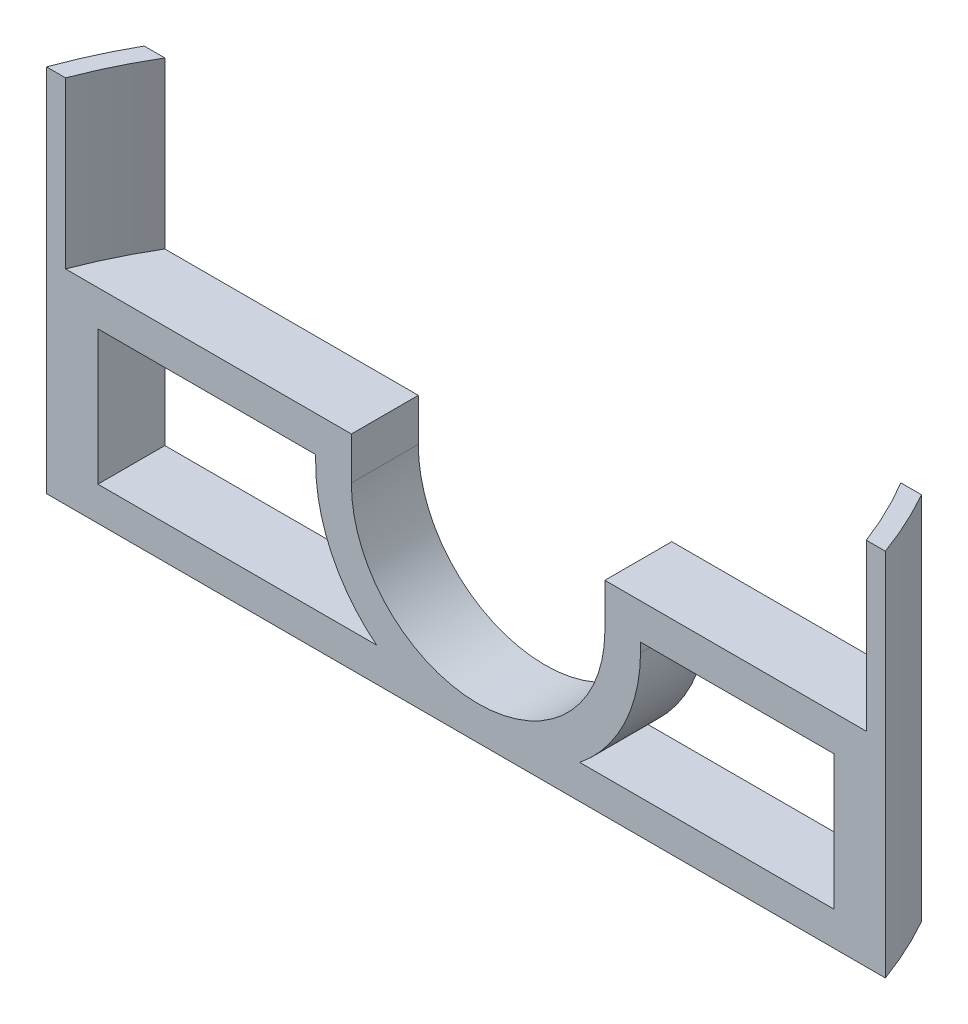
ISO-10303-21;
HEADER;
FILE_DESCRIPTION(('STEP AP214'),'2;1');
FILE_NAME('part.step','',(''),(''),'','','');
FILE_SCHEMA(('AUTOMOTIVE_DESIGN { 1 0 10303 214 1 1 1 1 }'));
ENDSEC;
DATA;
#1=APPLICATION_CONTEXT('core data for automotive mechanical design processes');
#2=APPLICATION_PROTOCOL_DEFINITION('international standard','automotive_design',2000,#1);
#3=PRODUCT_CONTEXT('',#1,'mechanical');
#4=PRODUCT('Part','Part','',(#3));
#5=PRODUCT_RELATED_PRODUCT_CATEGORY('part','',(#4));
#6=PRODUCT_DEFINITION_FORMATION('','',#4);
#7=PRODUCT_DEFINITION_CONTEXT('part definition',#1,'design');
#8=PRODUCT_DEFINITION('design','',#6,#7);
#9=PRODUCT_DEFINITION_SHAPE('','',#8);
#10=(LENGTH_UNIT() NAMED_UNIT(*) SI_UNIT(.MILLI.,.METRE.));
#11=(NAMED_UNIT(*) PLANE_ANGLE_UNIT() SI_UNIT($,.RADIAN.));
#12=(NAMED_UNIT(*) SI_UNIT($,.STERADIAN.) SOLID_ANGLE_UNIT());
#13=UNCERTAINTY_MEASURE_WITH_UNIT(LENGTH_MEASURE(1.E-05),#10,'distance_accuracy_value','');
#14=(GEOMETRIC_REPRESENTATION_CONTEXT(3) GLOBAL_UNCERTAINTY_ASSIGNED_CONTEXT((#13)) GLOBAL_UNIT_ASSIGNED_CONTEXT((#10,
#11,#12)) REPRESENTATION_CONTEXT('',''));
#15=CARTESIAN_POINT('',(0.,0.,0.));
#16=DIRECTION('',(0.,0.,1.));
#17=DIRECTION('',(1.,0.,0.));
#18=AXIS2_PLACEMENT_3D('',#15,#16,#17);
#19=CARTESIAN_POINT('',(61.4495521008681,24.1826103592965,7.5));
#20=DIRECTION('',(0.,0.,1.));
#21=DIRECTION('',(1.,0.,0.));
#22=AXIS2_PLACEMENT_3D('',#19,#20,#21);
#23=PLANE('',#22);
#24=DIRECTION('',(1.,0.,0.));
#25=VECTOR('',#24,1.);
#26=CARTESIAN_POINT('',(18.8436483280103,9.98314343639811,7.5));
#27=LINE('',#26,#25);
#28=CARTESIAN_POINT('',(18.8436483280103,9.98314343639811,7.5));
#29=VERTEX_POINT('',#28);
#30=CARTESIAN_POINT('',(50.0648392881245,9.98314343620562,7.5));
#31=VERTEX_POINT('',#30);
#32=EDGE_CURVE('E64',#29,#31,#27,.T.);
#33=ORIENTED_EDGE('',*,*,#32,.F.);
#34=DIRECTION('',(0.,-1.,0.));
#35=VECTOR('',#34,1.);
#36=CARTESIAN_POINT('',(18.8436483280103,25.0604388623193,7.5));
#37=LINE('',#36,#35);
#38=CARTESIAN_POINT('',(18.8436483280103,25.0604388623193,7.5));
#39=VERTEX_POINT('',#38);
#40=EDGE_CURVE('E247',#39,#29,#37,.T.);
#41=ORIENTED_EDGE('',*,*,#40,.F.);
#42=DIRECTION('',(-1.,0.,0.));
#43=VECTOR('',#42,1.);
#44=CARTESIAN_POINT('',(43.2500851779697,25.0604388623193,7.5));
#45=LINE('',#44,#43);
#46=CARTESIAN_POINT('',(43.2500851779697,25.0604388623193,7.5));
#47=VERTEX_POINT('',#46);
#48=EDGE_CURVE('E244',#47,#39,#45,.T.);
#49=ORIENTED_EDGE('',*,*,#48,.F.);
#50=DIRECTION('',(0.,1.,0.));
#51=VECTOR('',#50,1.);
#52=CARTESIAN_POINT('',(43.2500851779697,24.3056514317656,7.5));
#53=LINE('',#52,#51);
#54=CARTESIAN_POINT('',(43.2500851779697,24.3056514317656,7.5));
#55=VERTEX_POINT('',#54);
#56=EDGE_CURVE('E248',#55,#47,#53,.T.);
#57=ORIENTED_EDGE('',*,*,#56,.F.);
#58=CARTESIAN_POINT('',(61.4496106788494,24.1826099074887,7.5));
#59=DIRECTION('',(0.,0.,-1.));
#60=DIRECTION('',(-0.625538903013742,-0.780192976651524,0.));
#61=AXIS2_PLACEMENT_3D('',#58,#59,#60);
#62=CIRCLE('',#61,18.1999414199102);
#63=EDGE_CURVE('E362',#31,#55,#62,.T.);
#64=ORIENTED_EDGE('',*,*,#63,.F.);
#65=EDGE_LOOP('',(#33,#41,#49,#57,#64));
#66=FACE_BOUND('',#65,.T.);
#67=DIRECTION('',(1.,0.,0.));
#68=VECTOR('',#67,1.);
#69=CARTESIAN_POINT('',(108.081997981979,6.18261035929651,7.5));
#70=LINE('',#69,#68);
#71=CARTESIAN_POINT('',(13.0839761771822,6.1826103592965,7.5));
#72=VERTEX_POINT('',#71);
#73=CARTESIAN_POINT('',(107.080019786776,6.18261035929651,7.50000000000001));
#74=VERTEX_POINT('',#73);
#75=EDGE_CURVE('E329',#72,#74,#70,.T.);
#76=ORIENTED_EDGE('',*,*,#75,.T.);
#77=DIRECTION('',(0.,1.,0.));
#78=VECTOR('',#77,1.);
#79=CARTESIAN_POINT('',(107.080019786776,-3.27380668338016,7.50000000000001));
#80=LINE('',#79,#78);
#81=CARTESIAN_POINT('',(107.080019786776,47.6004388623193,7.50000000000001));
#82=VERTEX_POINT('',#81);
#83=EDGE_CURVE('E309',#74,#82,#80,.T.);
#84=ORIENTED_EDGE('',*,*,#83,.T.);
#85=DIRECTION('',(1.,0.,0.));
#86=VECTOR('',#85,1.);
#87=CARTESIAN_POINT('',(104.946394261926,47.6004388623193,7.50000000000001));
#88=LINE('',#87,#86);
#89=CARTESIAN_POINT('',(104.946394261926,47.6004388623193,7.50000000000003));
#90=VERTEX_POINT('',#89);
#91=EDGE_CURVE('E297',#90,#82,#88,.T.);
#92=ORIENTED_EDGE('',*,*,#91,.F.);
#93=DIRECTION('',(0.,1.,0.));
#94=VECTOR('',#93,1.);
#95=CARTESIAN_POINT('',(104.946394261926,-3.27380668338016,7.50000000000003));
#96=LINE('',#95,#94);
#97=CARTESIAN_POINT('',(104.946394261926,29.0604388623193,7.50000000000003));
#98=VERTEX_POINT('',#97);
#99=EDGE_CURVE('E310',#98,#90,#96,.T.);
#100=ORIENTED_EDGE('',*,*,#99,.F.);
#101=DIRECTION('',(-1.,0.,0.));
#102=VECTOR('',#101,1.);
#103=CARTESIAN_POINT('',(75.6490190237665,29.0604388623193,7.5));
#104=LINE('',#103,#102);
#105=CARTESIAN_POINT('',(75.6490190237665,29.0604388623193,7.5));
#106=VERTEX_POINT('',#105);
#107=EDGE_CURVE('E332',#98,#106,#104,.T.);
#108=ORIENTED_EDGE('',*,*,#107,.T.);
#109=DIRECTION('',(0.,-1.,0.));
#110=VECTOR('',#109,1.);
#111=CARTESIAN_POINT('',(75.6490190237665,24.0595692868282,7.5));
#112=LINE('',#111,#110);
#113=CARTESIAN_POINT('',(75.6490190237665,24.0595692868282,7.5));
#114=VERTEX_POINT('',#113);
#115=EDGE_CURVE('E334',#106,#114,#112,.T.);
#116=ORIENTED_EDGE('',*,*,#115,.T.);
#117=CARTESIAN_POINT('',(61.4495521008681,24.1826103592965,7.5));
#118=DIRECTION('',(0.,0.,-1.));
#119=DIRECTION('',(1.,0.,0.));
#120=AXIS2_PLACEMENT_3D('',#117,#118,#119);
#121=CIRCLE('',#120,14.2);
#122=CARTESIAN_POINT('',(47.2500851779697,24.3056514317656,7.5));
#123=VERTEX_POINT('',#122);
#124=EDGE_CURVE('E320',#114,#123,#121,.T.);
#125=ORIENTED_EDGE('',*,*,#124,.T.);
#126=DIRECTION('',(0.,1.,0.));
#127=VECTOR('',#126,1.);
#128=CARTESIAN_POINT('',(47.2500851779697,24.3056514317656,7.5));
#129=LINE('',#128,#127);
#130=CARTESIAN_POINT('',(47.2500851779697,29.0604388623193,7.5));
#131=VERTEX_POINT('',#130);
#132=EDGE_CURVE('E323',#123,#131,#129,.T.);
#133=ORIENTED_EDGE('',*,*,#132,.T.);
#134=DIRECTION('',(-1.,0.,0.));
#135=VECTOR('',#134,1.);
#136=CARTESIAN_POINT('',(12.081997981979,29.0604388623193,7.5));
#137=LINE('',#136,#135);
#138=CARTESIAN_POINT('',(15.2176017020316,29.0604388623193,7.49999999999999));
#139=VERTEX_POINT('',#138);
#140=EDGE_CURVE('E326',#131,#139,#137,.T.);
#141=ORIENTED_EDGE('',*,*,#140,.T.);
#142=DIRECTION('',(0.,1.,0.));
#143=VECTOR('',#142,1.);
#144=CARTESIAN_POINT('',(15.2176017020316,-3.27380668338017,7.49999999999999));
#145=LINE('',#144,#143);
#146=CARTESIAN_POINT('',(15.2176017020316,47.6004388623193,7.49999999999999));
#147=VERTEX_POINT('',#146);
#148=EDGE_CURVE('E281',#139,#147,#145,.T.);
#149=ORIENTED_EDGE('',*,*,#148,.T.);
#150=DIRECTION('',(-1.,0.,0.));
#151=VECTOR('',#150,1.);
#152=CARTESIAN_POINT('',(15.2176017020316,47.6004388623193,7.5));
#153=LINE('',#152,#151);
#154=CARTESIAN_POINT('',(13.0839761771822,47.6004388623193,7.5));
#155=VERTEX_POINT('',#154);
#156=EDGE_CURVE('E286',#147,#155,#153,.T.);
#157=ORIENTED_EDGE('',*,*,#156,.T.);
#158=DIRECTION('',(0.,1.,0.));
#159=VECTOR('',#158,1.);
#160=CARTESIAN_POINT('',(13.0839761771822,-3.27380668338017,7.5));
#161=LINE('',#160,#159);
#162=EDGE_CURVE('E279',#72,#155,#161,.T.);
#163=ORIENTED_EDGE('',*,*,#162,.F.);
#164=EDGE_LOOP('',(#76,#84,#92,#100,#108,#116,#125,#133,#141,#149,#157,#163));
#165=FACE_BOUND('',#164,.T.);
#166=DIRECTION('',(1.,0.,0.));
#167=VECTOR('',#166,1.);
#168=CARTESIAN_POINT('',(72.8343820702114,9.98314343639811,7.5));
#169=LINE('',#168,#167);
#170=CARTESIAN_POINT('',(72.8343820701038,9.98314343631216,7.5));
#171=VERTEX_POINT('',#170);
#172=CARTESIAN_POINT('',(101.320347635948,9.98314343639811,7.5));
#173=VERTEX_POINT('',#172);
#174=EDGE_CURVE('E56',#171,#173,#169,.T.);
#175=ORIENTED_EDGE('',*,*,#174,.F.);
#176=CARTESIAN_POINT('',(61.4496106788494,24.1826099074887,7.5));
#177=DIRECTION('',(0.,0.,-1.));
#178=DIRECTION('',(0.999962459332486,-0.00866486732303254,0.));
#179=AXIS2_PLACEMENT_3D('',#176,#177,#178);
#180=CIRCLE('',#179,18.1999414199102);
#181=CARTESIAN_POINT('',(79.6488688612027,24.0249098297948,7.5));
#182=VERTEX_POINT('',#181);
#183=EDGE_CURVE('E215',#182,#171,#180,.T.);
#184=ORIENTED_EDGE('',*,*,#183,.F.);
#185=DIRECTION('',(-0.000145010480182229,-0.99999998948598,0.));
#186=VECTOR('',#185,1.);
#187=CARTESIAN_POINT('',(79.6490190237665,25.0604388623193,7.5));
#188=LINE('',#187,#186);
#189=CARTESIAN_POINT('',(79.6490190237665,25.0604388623193,7.5));
#190=VERTEX_POINT('',#189);
#191=EDGE_CURVE('E213',#190,#182,#188,.T.);
#192=ORIENTED_EDGE('',*,*,#191,.F.);
#193=DIRECTION('',(-1.,0.,0.));
#194=VECTOR('',#193,1.);
#195=CARTESIAN_POINT('',(101.320347635948,25.0604388623193,7.5));
#196=LINE('',#195,#194);
#197=CARTESIAN_POINT('',(101.320347635948,25.0604388623193,7.5));
#198=VERTEX_POINT('',#197);
#199=EDGE_CURVE('E197',#198,#190,#196,.T.);
#200=ORIENTED_EDGE('',*,*,#199,.F.);
#201=DIRECTION('',(0.,1.,0.));
#202=VECTOR('',#201,1.);
#203=CARTESIAN_POINT('',(101.320347635948,9.98314343639811,7.5));
#204=LINE('',#203,#202);
#205=EDGE_CURVE('E207',#173,#198,#204,.T.);
#206=ORIENTED_EDGE('',*,*,#205,.F.);
#207=EDGE_LOOP('',(#175,#184,#192,#200,#206));
#208=FACE_BOUND('',#207,.T.);
#209=ADVANCED_FACE('F37',(#66,#165,#208),#23,.T.);
#210=CARTESIAN_POINT('',(61.4495521008681,24.1826103592965,0.));
#211=DIRECTION('',(0.,0.,1.));
#212=DIRECTION('',(1.,0.,0.));
#213=AXIS2_PLACEMENT_3D('',#210,#211,#212);
#214=PLANE('',#213);
#215=DIRECTION('',(0.,1.,0.));
#216=VECTOR('',#215,1.);
#217=CARTESIAN_POINT('',(103.631986296363,-3.27380668338016,0.));
#218=LINE('',#217,#216);
#219=CARTESIAN_POINT('',(103.631986296363,6.18261035929651,0.));
#220=VERTEX_POINT('',#219);
#221=CARTESIAN_POINT('',(103.631986296363,47.6004388623193,0.));
#222=VERTEX_POINT('',#221);
#223=EDGE_CURVE('E315',#220,#222,#218,.T.);
#224=ORIENTED_EDGE('',*,*,#223,.F.);
#225=DIRECTION('',(1.,0.,0.));
#226=VECTOR('',#225,1.);
#227=CARTESIAN_POINT('',(108.081997981979,6.18261035929651,0.));
#228=LINE('',#227,#226);
#229=CARTESIAN_POINT('',(16.532009667595,6.1826103592965,0.));
#230=VERTEX_POINT('',#229);
#231=EDGE_CURVE('E344',#230,#220,#228,.T.);
#232=ORIENTED_EDGE('',*,*,#231,.F.);
#233=DIRECTION('',(0.,1.,0.));
#234=VECTOR('',#233,1.);
#235=CARTESIAN_POINT('',(16.5320096675951,-3.27380668338017,0.));
#236=LINE('',#235,#234);
#237=CARTESIAN_POINT('',(16.532009667595,47.6004388623193,0.));
#238=VERTEX_POINT('',#237);
#239=EDGE_CURVE('E276',#230,#238,#236,.T.);
#240=ORIENTED_EDGE('',*,*,#239,.T.);
#241=DIRECTION('',(-1.,0.,0.));
#242=VECTOR('',#241,1.);
#243=CARTESIAN_POINT('',(18.8436483280103,47.6004388623193,0.));
#244=LINE('',#243,#242);
#245=CARTESIAN_POINT('',(18.8436483280103,47.6004388623193,0.));
#246=VERTEX_POINT('',#245);
#247=EDGE_CURVE('E292',#246,#238,#244,.T.);
#248=ORIENTED_EDGE('',*,*,#247,.F.);
#249=DIRECTION('',(0.,1.,0.));
#250=VECTOR('',#249,1.);
#251=CARTESIAN_POINT('',(18.8436483280103,-3.27380668338017,0.));
#252=LINE('',#251,#250);
#253=CARTESIAN_POINT('',(18.8436483280103,29.0604388623193,0.));
#254=VERTEX_POINT('',#253);
#255=EDGE_CURVE('E272',#254,#246,#252,.T.);
#256=ORIENTED_EDGE('',*,*,#255,.F.);
#257=DIRECTION('',(-1.,0.,0.));
#258=VECTOR('',#257,1.);
#259=CARTESIAN_POINT('',(12.081997981979,29.0604388623193,0.));
#260=LINE('',#259,#258);
#261=CARTESIAN_POINT('',(47.2500851779697,29.0604388623193,0.));
#262=VERTEX_POINT('',#261);
#263=EDGE_CURVE('E341',#262,#254,#260,.T.);
#264=ORIENTED_EDGE('',*,*,#263,.F.);
#265=DIRECTION('',(0.,1.,0.));
#266=VECTOR('',#265,1.);
#267=CARTESIAN_POINT('',(47.2500851779697,24.3056514317656,0.));
#268=LINE('',#267,#266);
#269=CARTESIAN_POINT('',(47.2500851779697,24.3056514317656,0.));
#270=VERTEX_POINT('',#269);
#271=EDGE_CURVE('E339',#270,#262,#268,.T.);
#272=ORIENTED_EDGE('',*,*,#271,.F.);
#273=CARTESIAN_POINT('',(61.4495521008681,24.1826103592965,0.));
#274=DIRECTION('',(0.,0.,-1.));
#275=DIRECTION('',(1.,0.,0.));
#276=AXIS2_PLACEMENT_3D('',#273,#274,#275);
#277=CIRCLE('',#276,14.2);
#278=CARTESIAN_POINT('',(75.6490190237665,24.0595692868282,0.));
#279=VERTEX_POINT('',#278);
#280=EDGE_CURVE('E319',#279,#270,#277,.T.);
#281=ORIENTED_EDGE('',*,*,#280,.F.);
#282=DIRECTION('',(0.,-1.,0.));
#283=VECTOR('',#282,1.);
#284=CARTESIAN_POINT('',(75.6490190237665,24.0595692868282,0.));
#285=LINE('',#284,#283);
#286=CARTESIAN_POINT('',(75.6490190237665,29.0604388623193,0.));
#287=VERTEX_POINT('',#286);
#288=EDGE_CURVE('E324',#287,#279,#285,.T.);
#289=ORIENTED_EDGE('',*,*,#288,.F.);
#290=DIRECTION('',(-1.,0.,0.));
#291=VECTOR('',#290,1.);
#292=CARTESIAN_POINT('',(75.6490190237665,29.0604388623193,0.));
#293=LINE('',#292,#291);
#294=CARTESIAN_POINT('',(101.320347635948,29.0604388623193,0.));
#295=VERTEX_POINT('',#294);
#296=EDGE_CURVE('E347',#295,#287,#293,.T.);
#297=ORIENTED_EDGE('',*,*,#296,.F.);
#298=DIRECTION('',(0.,1.,0.));
#299=VECTOR('',#298,1.);
#300=CARTESIAN_POINT('',(101.320347635948,-3.27380668338016,0.));
#301=LINE('',#300,#299);
#302=CARTESIAN_POINT('',(101.320347635948,47.6004388623193,0.));
#303=VERTEX_POINT('',#302);
#304=EDGE_CURVE('E313',#295,#303,#301,.T.);
#305=ORIENTED_EDGE('',*,*,#304,.T.);
#306=DIRECTION('',(1.,0.,0.));
#307=VECTOR('',#306,1.);
#308=CARTESIAN_POINT('',(101.320347635948,47.6004388623193,0.));
#309=LINE('',#308,#307);
#310=EDGE_CURVE('E303',#303,#222,#309,.T.);
#311=ORIENTED_EDGE('',*,*,#310,.T.);
#312=EDGE_LOOP('',(#224,#232,#240,#248,#256,#264,#272,#281,#289,#297,#305,#311));
#313=FACE_BOUND('',#312,.T.);
#314=DIRECTION('',(0.,1.,0.));
#315=VECTOR('',#314,1.);
#316=CARTESIAN_POINT('',(18.8436483280103,25.0604388623193,0.));
#317=LINE('',#316,#315);
#318=CARTESIAN_POINT('',(18.8436483280103,9.98314343639811,0.));
#319=VERTEX_POINT('',#318);
#320=CARTESIAN_POINT('',(18.8436483280103,25.0604388623193,0.));
#321=VERTEX_POINT('',#320);
#322=EDGE_CURVE('E239',#319,#321,#317,.T.);
#323=ORIENTED_EDGE('',*,*,#322,.F.);
#324=DIRECTION('',(-1.,0.,0.));
#325=VECTOR('',#324,1.);
#326=CARTESIAN_POINT('',(18.8436483280103,9.98314343639811,0.));
#327=LINE('',#326,#325);
#328=CARTESIAN_POINT('',(50.0648392882767,9.98314343639544,0.));
#329=VERTEX_POINT('',#328);
#330=EDGE_CURVE('E241',#329,#319,#327,.T.);
#331=ORIENTED_EDGE('',*,*,#330,.F.);
#332=CARTESIAN_POINT('',(61.4496106788494,24.1826099074887,0.));
#333=DIRECTION('',(0.,0.,1.));
#334=DIRECTION('',(1.,0.,0.));
#335=AXIS2_PLACEMENT_3D('',#332,#333,#334);
#336=CIRCLE('',#335,18.1999414199102);
#337=CARTESIAN_POINT('',(43.250085177577,24.3056514317682,0.));
#338=VERTEX_POINT('',#337);
#339=EDGE_CURVE('E243',#338,#329,#336,.T.);
#340=ORIENTED_EDGE('',*,*,#339,.F.);
#341=DIRECTION('',(0.,-1.,0.));
#342=VECTOR('',#341,1.);
#343=CARTESIAN_POINT('',(43.2500851779697,24.3056514317656,0.));
#344=LINE('',#343,#342);
#345=CARTESIAN_POINT('',(43.2500851779697,25.0604388623193,0.));
#346=VERTEX_POINT('',#345);
#347=EDGE_CURVE('E233',#346,#338,#344,.T.);
#348=ORIENTED_EDGE('',*,*,#347,.F.);
#349=DIRECTION('',(1.,0.,0.));
#350=VECTOR('',#349,1.);
#351=CARTESIAN_POINT('',(43.2500851779697,25.0604388623193,0.));
#352=LINE('',#351,#350);
#353=EDGE_CURVE('E236',#321,#346,#352,.T.);
#354=ORIENTED_EDGE('',*,*,#353,.F.);
#355=EDGE_LOOP('',(#323,#331,#340,#348,#354));
#356=FACE_BOUND('',#355,.T.);
#357=CARTESIAN_POINT('',(61.4496106788494,24.1826099074887,0.));
#358=DIRECTION('',(0.,0.,1.));
#359=DIRECTION('',(1.,0.,0.));
#360=AXIS2_PLACEMENT_3D('',#357,#358,#359);
#361=CIRCLE('',#360,18.1999414199102);
#362=CARTESIAN_POINT('',(72.8343820701038,9.98314343631216,0.));
#363=VERTEX_POINT('',#362);
#364=CARTESIAN_POINT('',(79.6488688612027,24.0249098297948,0.));
#365=VERTEX_POINT('',#364);
#366=EDGE_CURVE('E615',#363,#365,#361,.T.);
#367=ORIENTED_EDGE('',*,*,#366,.F.);
#368=DIRECTION('',(-1.,0.,0.));
#369=VECTOR('',#368,1.);
#370=CARTESIAN_POINT('',(72.8343820702114,9.98314343639811,0.));
#371=LINE('',#370,#369);
#372=CARTESIAN_POINT('',(101.320347635948,9.98314343639811,0.));
#373=VERTEX_POINT('',#372);
#374=EDGE_CURVE('E616',#373,#363,#371,.T.);
#375=ORIENTED_EDGE('',*,*,#374,.F.);
#376=DIRECTION('',(0.,-1.,0.));
#377=VECTOR('',#376,1.);
#378=CARTESIAN_POINT('',(101.320347635948,9.98314343639811,0.));
#379=LINE('',#378,#377);
#380=CARTESIAN_POINT('',(101.320347635948,25.0604388623193,0.));
#381=VERTEX_POINT('',#380);
#382=EDGE_CURVE('E230',#381,#373,#379,.T.);
#383=ORIENTED_EDGE('',*,*,#382,.F.);
#384=DIRECTION('',(1.,0.,0.));
#385=VECTOR('',#384,1.);
#386=CARTESIAN_POINT('',(101.320347635948,25.0604388623193,0.));
#387=LINE('',#386,#385);
#388=CARTESIAN_POINT('',(79.6490190237665,25.0604388623193,0.));
#389=VERTEX_POINT('',#388);
#390=EDGE_CURVE('E200',#389,#381,#387,.T.);
#391=ORIENTED_EDGE('',*,*,#390,.F.);
#392=DIRECTION('',(0.000145010480182229,0.99999998948598,0.));
#393=VECTOR('',#392,1.);
#394=CARTESIAN_POINT('',(79.6490190237665,25.0604388623193,0.));
#395=LINE('',#394,#393);
#396=EDGE_CURVE('E617',#365,#389,#395,.T.);
#397=ORIENTED_EDGE('',*,*,#396,.F.);
#398=EDGE_LOOP('',(#367,#375,#383,#391,#397));
#399=FACE_BOUND('',#398,.T.);
#400=ADVANCED_FACE('F374',(#313,#356,#399),#214,.F.);
#401=CARTESIAN_POINT('',(12.081997981979,29.0604388623193,7.5));
#402=DIRECTION('',(0.,-1.,0.));
#403=DIRECTION('',(1.,0.,0.));
#404=AXIS2_PLACEMENT_3D('',#401,#402,#403);
#405=PLANE('',#404);
#406=CARTESIAN_POINT('',(60.081997981979,29.0604388623193,24.5641714254119));
#407=DIRECTION('',(0.,-1.,0.));
#408=DIRECTION('',(1.,0.,0.));
#409=AXIS2_PLACEMENT_3D('',#406,#407,#408);
#410=CIRCLE('',#409,48.);
#411=EDGE_CURVE('E295',#139,#254,#410,.T.);
#412=ORIENTED_EDGE('',*,*,#411,.F.);
#413=ORIENTED_EDGE('',*,*,#140,.F.);
#414=DIRECTION('',(0.,0.,-1.));
#415=VECTOR('',#414,1.);
#416=CARTESIAN_POINT('',(47.2500851779697,29.0604388623193,7.5));
#417=LINE('',#416,#415);
#418=EDGE_CURVE('E48',#131,#262,#417,.T.);
#419=ORIENTED_EDGE('',*,*,#418,.T.);
#420=ORIENTED_EDGE('',*,*,#263,.T.);
#421=EDGE_LOOP('',(#412,#413,#419,#420));
#422=FACE_BOUND('',#421,.T.);
#423=ADVANCED_FACE('F380',(#422),#405,.F.);
#424=CARTESIAN_POINT('',(75.6490190237665,29.0604388623193,7.5));
#425=DIRECTION('',(0.,-1.,0.));
#426=DIRECTION('',(1.,0.,0.));
#427=AXIS2_PLACEMENT_3D('',#424,#425,#426);
#428=PLANE('',#427);
#429=CARTESIAN_POINT('',(60.081997981979,29.0604388623193,24.5641714254119));
#430=DIRECTION('',(0.,-1.,0.));
#431=DIRECTION('',(1.,0.,0.));
#432=AXIS2_PLACEMENT_3D('',#429,#430,#431);
#433=CIRCLE('',#432,48.);
#434=EDGE_CURVE('E312',#295,#98,#433,.T.);
#435=ORIENTED_EDGE('',*,*,#434,.F.);
#436=ORIENTED_EDGE('',*,*,#296,.T.);
#437=DIRECTION('',(0.,0.,-1.));
#438=VECTOR('',#437,1.);
#439=CARTESIAN_POINT('',(75.6490190237665,29.0604388623193,7.5));
#440=LINE('',#439,#438);
#441=EDGE_CURVE('E352',#106,#287,#440,.T.);
#442=ORIENTED_EDGE('',*,*,#441,.F.);
#443=ORIENTED_EDGE('',*,*,#107,.F.);
#444=EDGE_LOOP('',(#435,#436,#442,#443));
#445=FACE_BOUND('',#444,.T.);
#446=ADVANCED_FACE('F388',(#445),#428,.F.);
#447=CARTESIAN_POINT('',(61.4495521008681,24.1826103592965,7.5));
#448=DIRECTION('',(0.,0.,-1.));
#449=DIRECTION('',(-1.,0.,0.));
#450=AXIS2_PLACEMENT_3D('',#447,#448,#449);
#451=CYLINDRICAL_SURFACE('',#450,14.2);
#452=ORIENTED_EDGE('',*,*,#280,.T.);
#453=DIRECTION('',(0.,0.,-1.));
#454=VECTOR('',#453,1.);
#455=CARTESIAN_POINT('',(47.2500851779697,24.3056514317656,7.5));
#456=LINE('',#455,#454);
#457=EDGE_CURVE('E11',#123,#270,#456,.T.);
#458=ORIENTED_EDGE('',*,*,#457,.F.);
#459=ORIENTED_EDGE('',*,*,#124,.F.);
#460=DIRECTION('',(0.,0.,-1.));
#461=VECTOR('',#460,1.);
#462=CARTESIAN_POINT('',(75.6490190237665,24.0595692868282,7.5));
#463=LINE('',#462,#461);
#464=EDGE_CURVE('E336',#114,#279,#463,.T.);
#465=ORIENTED_EDGE('',*,*,#464,.T.);
#466=EDGE_LOOP('',(#452,#458,#459,#465));
#467=FACE_BOUND('',#466,.T.);
#468=ADVANCED_FACE('F39',(#467),#451,.F.);
#469=CARTESIAN_POINT('',(47.2500851779697,24.3056514317656,7.5));
#470=DIRECTION('',(-1.,0.,0.));
#471=DIRECTION('',(0.,0.,1.));
#472=AXIS2_PLACEMENT_3D('',#469,#470,#471);
#473=PLANE('',#472);
#474=ORIENTED_EDGE('',*,*,#271,.T.);
#475=ORIENTED_EDGE('',*,*,#418,.F.);
#476=ORIENTED_EDGE('',*,*,#132,.F.);
#477=ORIENTED_EDGE('',*,*,#457,.T.);
#478=EDGE_LOOP('',(#474,#475,#476,#477));
#479=FACE_BOUND('',#478,.T.);
#480=ADVANCED_FACE('F394',(#479),#473,.F.);
#481=CARTESIAN_POINT('',(108.081997981979,6.18261035929651,7.5));
#482=DIRECTION('',(0.,1.,0.));
#483=DIRECTION('',(-1.,0.,0.));
#484=AXIS2_PLACEMENT_3D('',#481,#482,#483);
#485=PLANE('',#484);
#486=ORIENTED_EDGE('',*,*,#231,.T.);
#487=CARTESIAN_POINT('',(60.081997981979,6.18261035929651,24.5641714254119));
#488=DIRECTION('',(0.,1.,0.));
#489=DIRECTION('',(-1.,0.,0.));
#490=AXIS2_PLACEMENT_3D('',#487,#488,#489);
#491=CIRCLE('',#490,50.);
#492=EDGE_CURVE('E269',#74,#220,#491,.T.);
#493=ORIENTED_EDGE('',*,*,#492,.F.);
#494=ORIENTED_EDGE('',*,*,#75,.F.);
#495=CARTESIAN_POINT('',(60.081997981979,6.18261035929651,24.5641714254119));
#496=DIRECTION('',(0.,1.,0.));
#497=DIRECTION('',(-1.,0.,0.));
#498=AXIS2_PLACEMENT_3D('',#495,#496,#497);
#499=CIRCLE('',#498,50.);
#500=EDGE_CURVE('E273',#230,#72,#499,.T.);
#501=ORIENTED_EDGE('',*,*,#500,.F.);
#502=EDGE_LOOP('',(#486,#493,#494,#501));
#503=FACE_BOUND('',#502,.T.);
#504=ADVANCED_FACE('F386',(#503),#485,.F.);
#505=CARTESIAN_POINT('',(75.6490190237665,24.0595692868282,7.5));
#506=DIRECTION('',(1.,0.,0.));
#507=DIRECTION('',(0.,0.,-1.));
#508=AXIS2_PLACEMENT_3D('',#505,#506,#507);
#509=PLANE('',#508);
#510=ORIENTED_EDGE('',*,*,#288,.T.);
#511=ORIENTED_EDGE('',*,*,#464,.F.);
#512=ORIENTED_EDGE('',*,*,#115,.F.);
#513=ORIENTED_EDGE('',*,*,#441,.T.);
#514=EDGE_LOOP('',(#510,#511,#512,#513));
#515=FACE_BOUND('',#514,.T.);
#516=ADVANCED_FACE('F382',(#515),#509,.F.);
#517=CARTESIAN_POINT('',(60.081997981979,-3.27380668338017,24.5641714254119));
#518=DIRECTION('',(0.,1.,0.));
#519=DIRECTION('',(-1.,0.,0.));
#520=AXIS2_PLACEMENT_3D('',#517,#518,#519);
#521=CYLINDRICAL_SURFACE('',#520,48.);
#522=ORIENTED_EDGE('',*,*,#304,.F.);
#523=ORIENTED_EDGE('',*,*,#434,.T.);
#524=ORIENTED_EDGE('',*,*,#99,.T.);
#525=CARTESIAN_POINT('',(60.081997981979,47.6004388623193,24.5641714254119));
#526=DIRECTION('',(0.,1.,0.));
#527=DIRECTION('',(-1.,0.,0.));
#528=AXIS2_PLACEMENT_3D('',#525,#526,#527);
#529=CIRCLE('',#528,48.);
#530=EDGE_CURVE('E306',#90,#303,#529,.T.);
#531=ORIENTED_EDGE('',*,*,#530,.T.);
#532=EDGE_LOOP('',(#522,#523,#524,#531));
#533=FACE_BOUND('',#532,.T.);
#534=ADVANCED_FACE('F385',(#533),#521,.F.);
#535=CARTESIAN_POINT('',(60.081997981979,-3.27380668338017,24.5641714254119));
#536=DIRECTION('',(0.,1.,0.));
#537=DIRECTION('',(-1.,0.,0.));
#538=AXIS2_PLACEMENT_3D('',#535,#536,#537);
#539=CYLINDRICAL_SURFACE('',#538,50.);
#540=ORIENTED_EDGE('',*,*,#83,.F.);
#541=ORIENTED_EDGE('',*,*,#492,.T.);
#542=ORIENTED_EDGE('',*,*,#223,.T.);
#543=CARTESIAN_POINT('',(60.081997981979,47.6004388623193,24.5641714254119));
#544=DIRECTION('',(0.,1.,0.));
#545=DIRECTION('',(-1.,0.,0.));
#546=AXIS2_PLACEMENT_3D('',#543,#544,#545);
#547=CIRCLE('',#546,50.);
#548=EDGE_CURVE('E300',#82,#222,#547,.T.);
#549=ORIENTED_EDGE('',*,*,#548,.F.);
#550=EDGE_LOOP('',(#540,#541,#542,#549));
#551=FACE_BOUND('',#550,.T.);
#552=ADVANCED_FACE('F375',(#551),#539,.T.);
#553=CARTESIAN_POINT('',(60.081997981979,47.6004388623193,24.5641714254119));
#554=DIRECTION('',(0.,1.,0.));
#555=DIRECTION('',(-1.,0.,0.));
#556=AXIS2_PLACEMENT_3D('',#553,#554,#555);
#557=PLANE('',#556);
#558=ORIENTED_EDGE('',*,*,#91,.T.);
#559=ORIENTED_EDGE('',*,*,#548,.T.);
#560=ORIENTED_EDGE('',*,*,#310,.F.);
#561=ORIENTED_EDGE('',*,*,#530,.F.);
#562=EDGE_LOOP('',(#558,#559,#560,#561));
#563=FACE_BOUND('',#562,.T.);
#564=ADVANCED_FACE('F433',(#563),#557,.T.);
#565=CARTESIAN_POINT('',(60.081997981979,-3.27380668338017,24.5641714254119));
#566=DIRECTION('',(0.,1.,0.));
#567=DIRECTION('',(-1.,0.,0.));
#568=AXIS2_PLACEMENT_3D('',#565,#566,#567);
#569=CYLINDRICAL_SURFACE('',#568,48.);
#570=ORIENTED_EDGE('',*,*,#148,.F.);
#571=ORIENTED_EDGE('',*,*,#411,.T.);
#572=ORIENTED_EDGE('',*,*,#255,.T.);
#573=CARTESIAN_POINT('',(60.081997981979,47.6004388623193,24.5641714254119));
#574=DIRECTION('',(0.,1.,0.));
#575=DIRECTION('',(-1.,0.,0.));
#576=AXIS2_PLACEMENT_3D('',#573,#574,#575);
#577=CIRCLE('',#576,48.);
#578=EDGE_CURVE('E278',#246,#147,#577,.T.);
#579=ORIENTED_EDGE('',*,*,#578,.T.);
#580=EDGE_LOOP('',(#570,#571,#572,#579));
#581=FACE_BOUND('',#580,.T.);
#582=ADVANCED_FACE('F415',(#581),#569,.F.);
#583=CARTESIAN_POINT('',(60.081997981979,-3.27380668338017,24.5641714254119));
#584=DIRECTION('',(0.,1.,0.));
#585=DIRECTION('',(-1.,0.,0.));
#586=AXIS2_PLACEMENT_3D('',#583,#584,#585);
#587=CYLINDRICAL_SURFACE('',#586,50.);
#588=ORIENTED_EDGE('',*,*,#239,.F.);
#589=ORIENTED_EDGE('',*,*,#500,.T.);
#590=ORIENTED_EDGE('',*,*,#162,.T.);
#591=CARTESIAN_POINT('',(60.081997981979,47.6004388623193,24.5641714254119));
#592=DIRECTION('',(0.,1.,0.));
#593=DIRECTION('',(-1.,0.,0.));
#594=AXIS2_PLACEMENT_3D('',#591,#592,#593);
#595=CIRCLE('',#594,50.);
#596=EDGE_CURVE('E289',#238,#155,#595,.T.);
#597=ORIENTED_EDGE('',*,*,#596,.F.);
#598=EDGE_LOOP('',(#588,#589,#590,#597));
#599=FACE_BOUND('',#598,.T.);
#600=ADVANCED_FACE('F440',(#599),#587,.T.);
#601=CARTESIAN_POINT('',(60.081997981979,47.6004388623193,24.5641714254119));
#602=DIRECTION('',(0.,1.,0.));
#603=DIRECTION('',(-1.,0.,0.));
#604=AXIS2_PLACEMENT_3D('',#601,#602,#603);
#605=PLANE('',#604);
#606=ORIENTED_EDGE('',*,*,#247,.T.);
#607=ORIENTED_EDGE('',*,*,#596,.T.);
#608=ORIENTED_EDGE('',*,*,#156,.F.);
#609=ORIENTED_EDGE('',*,*,#578,.F.);
#610=EDGE_LOOP('',(#606,#607,#608,#609));
#611=FACE_BOUND('',#610,.T.);
#612=ADVANCED_FACE('F443',(#611),#605,.T.);
#613=CARTESIAN_POINT('',(18.8436483280103,9.98314343639811,-34.67113500216));
#614=DIRECTION('',(0.,-1.,0.));
#615=DIRECTION('',(0.,0.,-1.));
#616=AXIS2_PLACEMENT_3D('',#613,#614,#615);
#617=PLANE('',#616);
#618=ORIENTED_EDGE('',*,*,#330,.T.);
#619=DIRECTION('',(0.,0.,1.));
#620=VECTOR('',#619,1.);
#621=CARTESIAN_POINT('',(18.8436483280103,9.98314343639811,-34.67113500216));
#622=LINE('',#621,#620);
#623=EDGE_CURVE('E237',#319,#29,#622,.T.);
#624=ORIENTED_EDGE('',*,*,#623,.T.);
#625=ORIENTED_EDGE('',*,*,#32,.T.);
#626=DIRECTION('',(0.,0.,1.));
#627=VECTOR('',#626,1.);
#628=CARTESIAN_POINT('',(50.0648392882767,9.98314343639544,-34.67113500216));
#629=LINE('',#628,#627);
#630=EDGE_CURVE('E251',#329,#31,#629,.T.);
#631=ORIENTED_EDGE('',*,*,#630,.F.);
#632=EDGE_LOOP('',(#618,#624,#625,#631));
#633=FACE_BOUND('',#632,.T.);
#634=ADVANCED_FACE('F445',(#633),#617,.F.);
#635=CARTESIAN_POINT('',(18.8436483280103,25.0604388623193,-34.67113500216));
#636=DIRECTION('',(-1.,0.,0.));
#637=DIRECTION('',(0.,-1.,0.));
#638=AXIS2_PLACEMENT_3D('',#635,#636,#637);
#639=PLANE('',#638);
#640=ORIENTED_EDGE('',*,*,#322,.T.);
#641=DIRECTION('',(0.,0.,1.));
#642=VECTOR('',#641,1.);
#643=CARTESIAN_POINT('',(18.8436483280103,25.0604388623193,-34.67113500216));
#644=LINE('',#643,#642);
#645=EDGE_CURVE('E253',#321,#39,#644,.T.);
#646=ORIENTED_EDGE('',*,*,#645,.T.);
#647=ORIENTED_EDGE('',*,*,#40,.T.);
#648=ORIENTED_EDGE('',*,*,#623,.F.);
#649=EDGE_LOOP('',(#640,#646,#647,#648));
#650=FACE_BOUND('',#649,.T.);
#651=ADVANCED_FACE('F451',(#650),#639,.F.);
#652=CARTESIAN_POINT('',(43.2500851779697,25.0604388623193,-34.67113500216));
#653=DIRECTION('',(0.,1.,0.));
#654=DIRECTION('',(-1.,0.,0.));
#655=AXIS2_PLACEMENT_3D('',#652,#653,#654);
#656=PLANE('',#655);
#657=ORIENTED_EDGE('',*,*,#353,.T.);
#658=DIRECTION('',(0.,0.,1.));
#659=VECTOR('',#658,1.);
#660=CARTESIAN_POINT('',(43.2500851779697,25.0604388623193,-34.67113500216));
#661=LINE('',#660,#659);
#662=EDGE_CURVE('E255',#346,#47,#661,.T.);
#663=ORIENTED_EDGE('',*,*,#662,.T.);
#664=ORIENTED_EDGE('',*,*,#48,.T.);
#665=ORIENTED_EDGE('',*,*,#645,.F.);
#666=EDGE_LOOP('',(#657,#663,#664,#665));
#667=FACE_BOUND('',#666,.T.);
#668=ADVANCED_FACE('F509',(#667),#656,.F.);
#669=CARTESIAN_POINT('',(43.2500851779697,24.3056514317656,-34.67113500216));
#670=DIRECTION('',(1.,0.,0.));
#671=DIRECTION('',(0.,0.,-1.));
#672=AXIS2_PLACEMENT_3D('',#669,#670,#671);
#673=PLANE('',#672);
#674=ORIENTED_EDGE('',*,*,#347,.T.);
#675=DIRECTION('',(0.,0.,1.));
#676=VECTOR('',#675,1.);
#677=CARTESIAN_POINT('',(43.2500851779697,24.3056514317656,-34.67113500216));
#678=LINE('',#677,#676);
#679=EDGE_CURVE('E257',#338,#55,#678,.T.);
#680=ORIENTED_EDGE('',*,*,#679,.T.);
#681=ORIENTED_EDGE('',*,*,#56,.T.);
#682=ORIENTED_EDGE('',*,*,#662,.F.);
#683=EDGE_LOOP('',(#674,#680,#681,#682));
#684=FACE_BOUND('',#683,.T.);
#685=ADVANCED_FACE('F519',(#684),#673,.F.);
#686=CARTESIAN_POINT('',(61.4496106788494,24.1826099074887,-34.67113500216));
#687=DIRECTION('',(0.,0.,1.));
#688=DIRECTION('',(1.,0.,0.));
#689=AXIS2_PLACEMENT_3D('',#686,#687,#688);
#690=CYLINDRICAL_SURFACE('',#689,18.1999414199102);
#691=ORIENTED_EDGE('',*,*,#339,.T.);
#692=ORIENTED_EDGE('',*,*,#630,.T.);
#693=ORIENTED_EDGE('',*,*,#63,.T.);
#694=ORIENTED_EDGE('',*,*,#679,.F.);
#695=EDGE_LOOP('',(#691,#692,#693,#694));
#696=FACE_BOUND('',#695,.T.);
#697=ADVANCED_FACE('F529',(#696),#690,.T.);
#698=CARTESIAN_POINT('',(72.8343820702114,9.98314343639811,-34.67113500216));
#699=DIRECTION('',(0.,-1.,0.));
#700=DIRECTION('',(1.,0.,0.));
#701=AXIS2_PLACEMENT_3D('',#698,#699,#700);
#702=PLANE('',#701);
#703=ORIENTED_EDGE('',*,*,#374,.T.);
#704=DIRECTION('',(0.,0.,1.));
#705=VECTOR('',#704,1.);
#706=CARTESIAN_POINT('',(72.8343820701038,9.98314343631216,-34.67113500216));
#707=LINE('',#706,#705);
#708=EDGE_CURVE('E229',#363,#171,#707,.T.);
#709=ORIENTED_EDGE('',*,*,#708,.T.);
#710=ORIENTED_EDGE('',*,*,#174,.T.);
#711=DIRECTION('',(0.,0.,1.));
#712=VECTOR('',#711,1.);
#713=CARTESIAN_POINT('',(101.320347635948,9.98314343639811,-34.67113500216));
#714=LINE('',#713,#712);
#715=EDGE_CURVE('E204',#373,#173,#714,.T.);
#716=ORIENTED_EDGE('',*,*,#715,.F.);
#717=EDGE_LOOP('',(#703,#709,#710,#716));
#718=FACE_BOUND('',#717,.T.);
#719=ADVANCED_FACE('F539',(#718),#702,.F.);
#720=CARTESIAN_POINT('',(61.4496106788494,24.1826099074887,-34.67113500216));
#721=DIRECTION('',(0.,0.,1.));
#722=DIRECTION('',(1.,0.,0.));
#723=AXIS2_PLACEMENT_3D('',#720,#721,#722);
#724=CYLINDRICAL_SURFACE('',#723,18.1999414199102);
#725=ORIENTED_EDGE('',*,*,#366,.T.);
#726=DIRECTION('',(0.,0.,1.));
#727=VECTOR('',#726,1.);
#728=CARTESIAN_POINT('',(79.6488688612027,24.0249098297948,-34.67113500216));
#729=LINE('',#728,#727);
#730=EDGE_CURVE('E219',#365,#182,#729,.T.);
#731=ORIENTED_EDGE('',*,*,#730,.T.);
#732=ORIENTED_EDGE('',*,*,#183,.T.);
#733=ORIENTED_EDGE('',*,*,#708,.F.);
#734=EDGE_LOOP('',(#725,#731,#732,#733));
#735=FACE_BOUND('',#734,.T.);
#736=ADVANCED_FACE('F549',(#735),#724,.T.);
#737=CARTESIAN_POINT('',(79.6490190237665,25.0604388623193,-34.67113500216));
#738=DIRECTION('',(-0.99999998948598,0.000145010480182229,0.));
#739=DIRECTION('',(-0.000145010480182229,-0.99999998948598,0.));
#740=AXIS2_PLACEMENT_3D('',#737,#738,#739);
#741=PLANE('',#740);
#742=ORIENTED_EDGE('',*,*,#396,.T.);
#743=DIRECTION('',(0.,0.,1.));
#744=VECTOR('',#743,1.);
#745=CARTESIAN_POINT('',(79.6490190237665,25.0604388623193,-34.67113500216));
#746=LINE('',#745,#744);
#747=EDGE_CURVE('E203',#389,#190,#746,.T.);
#748=ORIENTED_EDGE('',*,*,#747,.T.);
#749=ORIENTED_EDGE('',*,*,#191,.T.);
#750=ORIENTED_EDGE('',*,*,#730,.F.);
#751=EDGE_LOOP('',(#742,#748,#749,#750));
#752=FACE_BOUND('',#751,.T.);
#753=ADVANCED_FACE('F558',(#752),#741,.F.);
#754=CARTESIAN_POINT('',(101.320347635948,25.0604388623193,-34.67113500216));
#755=DIRECTION('',(0.,1.,0.));
#756=DIRECTION('',(-1.,0.,0.));
#757=AXIS2_PLACEMENT_3D('',#754,#755,#756);
#758=PLANE('',#757);
#759=ORIENTED_EDGE('',*,*,#390,.T.);
#760=DIRECTION('',(0.,0.,1.));
#761=VECTOR('',#760,1.);
#762=CARTESIAN_POINT('',(101.320347635948,25.0604388623193,-34.67113500216));
#763=LINE('',#762,#761);
#764=EDGE_CURVE('E192',#381,#198,#763,.T.);
#765=ORIENTED_EDGE('',*,*,#764,.T.);
#766=ORIENTED_EDGE('',*,*,#199,.T.);
#767=ORIENTED_EDGE('',*,*,#747,.F.);
#768=EDGE_LOOP('',(#759,#765,#766,#767));
#769=FACE_BOUND('',#768,.T.);
#770=ADVANCED_FACE('F194',(#769),#758,.F.);
#771=CARTESIAN_POINT('',(101.320347635948,9.98314343639811,-34.67113500216));
#772=DIRECTION('',(1.,0.,0.));
#773=DIRECTION('',(0.,0.,-1.));
#774=AXIS2_PLACEMENT_3D('',#771,#772,#773);
#775=PLANE('',#774);
#776=ORIENTED_EDGE('',*,*,#382,.T.);
#777=ORIENTED_EDGE('',*,*,#715,.T.);
#778=ORIENTED_EDGE('',*,*,#205,.T.);
#779=ORIENTED_EDGE('',*,*,#764,.F.);
#780=EDGE_LOOP('',(#776,#777,#778,#779));
#781=FACE_BOUND('',#780,.T.);
#782=ADVANCED_FACE('F208',(#781),#775,.F.);
#783=CLOSED_SHELL('',(#209,#400,#423,#446,#468,#480,#504,#516,#534,#552,#564,#582,#600,#612,
#634,#651,#668,#685,#697,#719,#736,#753,#770,#782));
#784=MANIFOLD_SOLID_BREP('B2',#783);
#785=ADVANCED_BREP_SHAPE_REPRESENTATION('',(#18,#784),#14);
#786=SHAPE_DEFINITION_REPRESENTATION(#9,#785);
ENDSEC;
END-ISO-10303-21;
